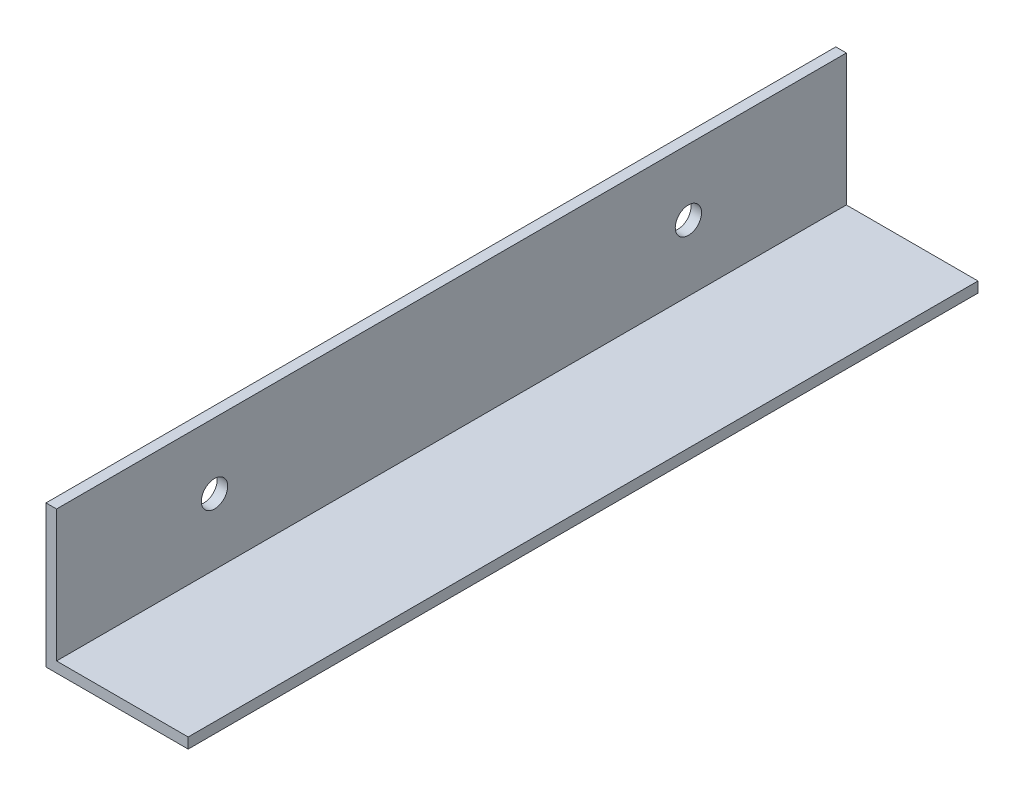
ISO-10303-21;
HEADER;
FILE_DESCRIPTION(('STEP AP214'),'2;1');
FILE_NAME('part.step','',(''),(''),'','','');
FILE_SCHEMA(('AUTOMOTIVE_DESIGN { 1 0 10303 214 1 1 1 1 }'));
ENDSEC;
DATA;
#1=APPLICATION_CONTEXT('core data for automotive mechanical design processes');
#2=APPLICATION_PROTOCOL_DEFINITION('international standard','automotive_design',2000,#1);
#3=PRODUCT_CONTEXT('',#1,'mechanical');
#4=PRODUCT('Part','Part','',(#3));
#5=PRODUCT_RELATED_PRODUCT_CATEGORY('part','',(#4));
#6=PRODUCT_DEFINITION_FORMATION('','',#4);
#7=PRODUCT_DEFINITION_CONTEXT('part definition',#1,'design');
#8=PRODUCT_DEFINITION('design','',#6,#7);
#9=PRODUCT_DEFINITION_SHAPE('','',#8);
#10=(LENGTH_UNIT() NAMED_UNIT(*) SI_UNIT(.MILLI.,.METRE.));
#11=(NAMED_UNIT(*) PLANE_ANGLE_UNIT() SI_UNIT($,.RADIAN.));
#12=(NAMED_UNIT(*) SI_UNIT($,.STERADIAN.) SOLID_ANGLE_UNIT());
#13=UNCERTAINTY_MEASURE_WITH_UNIT(LENGTH_MEASURE(1.E-05),#10,'distance_accuracy_value','');
#14=(GEOMETRIC_REPRESENTATION_CONTEXT(3) GLOBAL_UNCERTAINTY_ASSIGNED_CONTEXT((#13)) GLOBAL_UNIT_ASSIGNED_CONTEXT((#10,
#11,#12)) REPRESENTATION_CONTEXT('',''));
#15=CARTESIAN_POINT('',(0.,0.,0.));
#16=DIRECTION('',(0.,0.,1.));
#17=DIRECTION('',(1.,0.,0.));
#18=AXIS2_PLACEMENT_3D('',#15,#16,#17);
#19=CARTESIAN_POINT('',(0.,0.,150.));
#20=DIRECTION('',(-1.,0.,0.));
#21=DIRECTION('',(0.,0.,1.));
#22=AXIS2_PLACEMENT_3D('',#19,#20,#21);
#23=PLANE('',#22);
#24=CARTESIAN_POINT('',(0.,12.5,30.));
#25=DIRECTION('',(-1.,0.,0.));
#26=DIRECTION('',(0.,0.,1.));
#27=AXIS2_PLACEMENT_3D('',#24,#25,#26);
#28=CIRCLE('',#27,2.5);
#29=CARTESIAN_POINT('',(0.,12.5,32.5));
#30=VERTEX_POINT('',#29);
#31=EDGE_CURVE('E159',#30,#30,#28,.T.);
#32=ORIENTED_EDGE('',*,*,#31,.T.);
#33=EDGE_LOOP('',(#32));
#34=FACE_BOUND('',#33,.T.);
#35=CARTESIAN_POINT('',(0.,12.5,120.));
#36=DIRECTION('',(-1.,0.,0.));
#37=DIRECTION('',(0.,0.,1.));
#38=AXIS2_PLACEMENT_3D('',#35,#36,#37);
#39=CIRCLE('',#38,2.5);
#40=CARTESIAN_POINT('',(0.,12.5,122.5));
#41=VERTEX_POINT('',#40);
#42=EDGE_CURVE('E120',#41,#41,#39,.T.);
#43=ORIENTED_EDGE('',*,*,#42,.T.);
#44=EDGE_LOOP('',(#43));
#45=FACE_BOUND('',#44,.T.);
#46=DIRECTION('',(0.,1.,0.));
#47=VECTOR('',#46,1.);
#48=CARTESIAN_POINT('',(0.,0.,0.));
#49=LINE('',#48,#47);
#50=CARTESIAN_POINT('',(0.,0.,0.));
#51=VERTEX_POINT('',#50);
#52=CARTESIAN_POINT('',(0.,25.,0.));
#53=VERTEX_POINT('',#52);
#54=EDGE_CURVE('E116',#51,#53,#49,.T.);
#55=ORIENTED_EDGE('',*,*,#54,.T.);
#56=DIRECTION('',(0.,0.,-1.));
#57=VECTOR('',#56,1.);
#58=CARTESIAN_POINT('',(0.,25.,150.));
#59=LINE('',#58,#57);
#60=CARTESIAN_POINT('',(0.,25.,150.));
#61=VERTEX_POINT('',#60);
#62=EDGE_CURVE('E11',#61,#53,#59,.T.);
#63=ORIENTED_EDGE('',*,*,#62,.F.);
#64=DIRECTION('',(0.,1.,0.));
#65=VECTOR('',#64,1.);
#66=CARTESIAN_POINT('',(0.,0.,150.));
#67=LINE('',#66,#65);
#68=CARTESIAN_POINT('',(0.,0.,150.));
#69=VERTEX_POINT('',#68);
#70=EDGE_CURVE('E127',#69,#61,#67,.T.);
#71=ORIENTED_EDGE('',*,*,#70,.F.);
#72=DIRECTION('',(0.,0.,-1.));
#73=VECTOR('',#72,1.);
#74=CARTESIAN_POINT('',(0.,0.,150.));
#75=LINE('',#74,#73);
#76=EDGE_CURVE('E112',#69,#51,#75,.T.);
#77=ORIENTED_EDGE('',*,*,#76,.T.);
#78=EDGE_LOOP('',(#55,#63,#71,#77));
#79=FACE_BOUND('',#78,.T.);
#80=ADVANCED_FACE('F32',(#34,#45,#79),#23,.F.);
#81=CARTESIAN_POINT('',(-2.,25.,150.));
#82=DIRECTION('',(0.,-1.,0.));
#83=DIRECTION('',(0.,0.,-1.));
#84=AXIS2_PLACEMENT_3D('',#81,#82,#83);
#85=PLANE('',#84);
#86=DIRECTION('',(-1.,0.,0.));
#87=VECTOR('',#86,1.);
#88=CARTESIAN_POINT('',(-2.,25.,0.));
#89=LINE('',#88,#87);
#90=CARTESIAN_POINT('',(-2.,25.,0.));
#91=VERTEX_POINT('',#90);
#92=EDGE_CURVE('E119',#53,#91,#89,.T.);
#93=ORIENTED_EDGE('',*,*,#92,.T.);
#94=DIRECTION('',(0.,0.,-1.));
#95=VECTOR('',#94,1.);
#96=CARTESIAN_POINT('',(-2.,25.,150.));
#97=LINE('',#96,#95);
#98=CARTESIAN_POINT('',(-2.,25.,150.));
#99=VERTEX_POINT('',#98);
#100=EDGE_CURVE('E40',#99,#91,#97,.T.);
#101=ORIENTED_EDGE('',*,*,#100,.F.);
#102=DIRECTION('',(-1.,0.,0.));
#103=VECTOR('',#102,1.);
#104=CARTESIAN_POINT('',(-2.,25.,150.));
#105=LINE('',#104,#103);
#106=EDGE_CURVE('E85',#61,#99,#105,.T.);
#107=ORIENTED_EDGE('',*,*,#106,.F.);
#108=ORIENTED_EDGE('',*,*,#62,.T.);
#109=EDGE_LOOP('',(#93,#101,#107,#108));
#110=FACE_BOUND('',#109,.T.);
#111=ADVANCED_FACE('F151',(#110),#85,.F.);
#112=CARTESIAN_POINT('',(-2.,-2.,150.));
#113=DIRECTION('',(1.,0.,0.));
#114=DIRECTION('',(0.,0.,-1.));
#115=AXIS2_PLACEMENT_3D('',#112,#113,#114);
#116=PLANE('',#115);
#117=CARTESIAN_POINT('',(-2.,12.5,30.));
#118=DIRECTION('',(1.,0.,0.));
#119=DIRECTION('',(0.,0.,-1.));
#120=AXIS2_PLACEMENT_3D('',#117,#118,#119);
#121=CIRCLE('',#120,2.5);
#122=CARTESIAN_POINT('',(-2.,12.5,27.5));
#123=VERTEX_POINT('',#122);
#124=EDGE_CURVE('E171',#123,#123,#121,.T.);
#125=ORIENTED_EDGE('',*,*,#124,.T.);
#126=EDGE_LOOP('',(#125));
#127=FACE_BOUND('',#126,.T.);
#128=CARTESIAN_POINT('',(-2.,12.5,120.));
#129=DIRECTION('',(1.,0.,0.));
#130=DIRECTION('',(0.,0.,-1.));
#131=AXIS2_PLACEMENT_3D('',#128,#129,#130);
#132=CIRCLE('',#131,2.5);
#133=CARTESIAN_POINT('',(-2.,12.5,117.5));
#134=VERTEX_POINT('',#133);
#135=EDGE_CURVE('E163',#134,#134,#132,.T.);
#136=ORIENTED_EDGE('',*,*,#135,.T.);
#137=EDGE_LOOP('',(#136));
#138=FACE_BOUND('',#137,.T.);
#139=DIRECTION('',(0.,-1.,0.));
#140=VECTOR('',#139,1.);
#141=CARTESIAN_POINT('',(-2.,-2.,0.));
#142=LINE('',#141,#140);
#143=CARTESIAN_POINT('',(-2.,-2.,0.));
#144=VERTEX_POINT('',#143);
#145=EDGE_CURVE('E122',#91,#144,#142,.T.);
#146=ORIENTED_EDGE('',*,*,#145,.T.);
#147=DIRECTION('',(0.,0.,-1.));
#148=VECTOR('',#147,1.);
#149=CARTESIAN_POINT('',(-2.,-2.,150.));
#150=LINE('',#149,#148);
#151=CARTESIAN_POINT('',(-2.,-2.,150.));
#152=VERTEX_POINT('',#151);
#153=EDGE_CURVE('E107',#152,#144,#150,.T.);
#154=ORIENTED_EDGE('',*,*,#153,.F.);
#155=DIRECTION('',(0.,-1.,0.));
#156=VECTOR('',#155,1.);
#157=CARTESIAN_POINT('',(-2.,-2.,150.));
#158=LINE('',#157,#156);
#159=EDGE_CURVE('E98',#99,#152,#158,.T.);
#160=ORIENTED_EDGE('',*,*,#159,.F.);
#161=ORIENTED_EDGE('',*,*,#100,.T.);
#162=EDGE_LOOP('',(#146,#154,#160,#161));
#163=FACE_BOUND('',#162,.T.);
#164=ADVANCED_FACE('F133',(#127,#138,#163),#116,.F.);
#165=CARTESIAN_POINT('',(-2.,-2.,150.));
#166=DIRECTION('',(0.,1.,0.));
#167=DIRECTION('',(0.,0.,1.));
#168=AXIS2_PLACEMENT_3D('',#165,#166,#167);
#169=PLANE('',#168);
#170=DIRECTION('',(1.,0.,0.));
#171=VECTOR('',#170,1.);
#172=CARTESIAN_POINT('',(-2.,-2.,0.));
#173=LINE('',#172,#171);
#174=CARTESIAN_POINT('',(25.,-2.,0.));
#175=VERTEX_POINT('',#174);
#176=EDGE_CURVE('E106',#144,#175,#173,.T.);
#177=ORIENTED_EDGE('',*,*,#176,.T.);
#178=DIRECTION('',(0.,0.,-1.));
#179=VECTOR('',#178,1.);
#180=CARTESIAN_POINT('',(25.,-2.,150.));
#181=LINE('',#180,#179);
#182=CARTESIAN_POINT('',(25.,-2.,150.));
#183=VERTEX_POINT('',#182);
#184=EDGE_CURVE('E103',#183,#175,#181,.T.);
#185=ORIENTED_EDGE('',*,*,#184,.F.);
#186=DIRECTION('',(1.,0.,0.));
#187=VECTOR('',#186,1.);
#188=CARTESIAN_POINT('',(-2.,-2.,150.));
#189=LINE('',#188,#187);
#190=EDGE_CURVE('E92',#152,#183,#189,.T.);
#191=ORIENTED_EDGE('',*,*,#190,.F.);
#192=ORIENTED_EDGE('',*,*,#153,.T.);
#193=EDGE_LOOP('',(#177,#185,#191,#192));
#194=FACE_BOUND('',#193,.T.);
#195=ADVANCED_FACE('F104',(#194),#169,.F.);
#196=CARTESIAN_POINT('',(25.,0.,150.));
#197=DIRECTION('',(-1.,0.,0.));
#198=DIRECTION('',(0.,0.,1.));
#199=AXIS2_PLACEMENT_3D('',#196,#197,#198);
#200=PLANE('',#199);
#201=DIRECTION('',(0.,1.,0.));
#202=VECTOR('',#201,1.);
#203=CARTESIAN_POINT('',(25.,0.,0.));
#204=LINE('',#203,#202);
#205=CARTESIAN_POINT('',(25.,0.,0.));
#206=VERTEX_POINT('',#205);
#207=EDGE_CURVE('E71',#175,#206,#204,.T.);
#208=ORIENTED_EDGE('',*,*,#207,.T.);
#209=DIRECTION('',(0.,0.,-1.));
#210=VECTOR('',#209,1.);
#211=CARTESIAN_POINT('',(25.,0.,150.));
#212=LINE('',#211,#210);
#213=CARTESIAN_POINT('',(25.,0.,150.));
#214=VERTEX_POINT('',#213);
#215=EDGE_CURVE('E108',#214,#206,#212,.T.);
#216=ORIENTED_EDGE('',*,*,#215,.F.);
#217=DIRECTION('',(0.,1.,0.));
#218=VECTOR('',#217,1.);
#219=CARTESIAN_POINT('',(25.,0.,150.));
#220=LINE('',#219,#218);
#221=EDGE_CURVE('E96',#183,#214,#220,.T.);
#222=ORIENTED_EDGE('',*,*,#221,.F.);
#223=ORIENTED_EDGE('',*,*,#184,.T.);
#224=EDGE_LOOP('',(#208,#216,#222,#223));
#225=FACE_BOUND('',#224,.T.);
#226=ADVANCED_FACE('F110',(#225),#200,.F.);
#227=CARTESIAN_POINT('',(0.,0.,150.));
#228=DIRECTION('',(0.,-1.,0.));
#229=DIRECTION('',(0.,0.,-1.));
#230=AXIS2_PLACEMENT_3D('',#227,#228,#229);
#231=PLANE('',#230);
#232=DIRECTION('',(-1.,0.,0.));
#233=VECTOR('',#232,1.);
#234=CARTESIAN_POINT('',(0.,0.,0.));
#235=LINE('',#234,#233);
#236=EDGE_CURVE('E77',#206,#51,#235,.T.);
#237=ORIENTED_EDGE('',*,*,#236,.T.);
#238=ORIENTED_EDGE('',*,*,#76,.F.);
#239=DIRECTION('',(-1.,0.,0.));
#240=VECTOR('',#239,1.);
#241=CARTESIAN_POINT('',(0.,0.,150.));
#242=LINE('',#241,#240);
#243=EDGE_CURVE('E48',#214,#69,#242,.T.);
#244=ORIENTED_EDGE('',*,*,#243,.F.);
#245=ORIENTED_EDGE('',*,*,#215,.T.);
#246=EDGE_LOOP('',(#237,#238,#244,#245));
#247=FACE_BOUND('',#246,.T.);
#248=ADVANCED_FACE('F140',(#247),#231,.F.);
#249=CARTESIAN_POINT('',(0.,0.,150.));
#250=DIRECTION('',(0.,0.,-1.));
#251=DIRECTION('',(-1.,0.,0.));
#252=AXIS2_PLACEMENT_3D('',#249,#250,#251);
#253=PLANE('',#252);
#254=ORIENTED_EDGE('',*,*,#70,.T.);
#255=ORIENTED_EDGE('',*,*,#106,.T.);
#256=ORIENTED_EDGE('',*,*,#159,.T.);
#257=ORIENTED_EDGE('',*,*,#190,.T.);
#258=ORIENTED_EDGE('',*,*,#221,.T.);
#259=ORIENTED_EDGE('',*,*,#243,.T.);
#260=EDGE_LOOP('',(#254,#255,#256,#257,#258,#259));
#261=FACE_BOUND('',#260,.T.);
#262=ADVANCED_FACE('F94',(#261),#253,.F.);
#263=CARTESIAN_POINT('',(0.,0.,0.));
#264=DIRECTION('',(0.,0.,-1.));
#265=DIRECTION('',(-1.,0.,0.));
#266=AXIS2_PLACEMENT_3D('',#263,#264,#265);
#267=PLANE('',#266);
#268=ORIENTED_EDGE('',*,*,#54,.F.);
#269=ORIENTED_EDGE('',*,*,#236,.F.);
#270=ORIENTED_EDGE('',*,*,#207,.F.);
#271=ORIENTED_EDGE('',*,*,#176,.F.);
#272=ORIENTED_EDGE('',*,*,#145,.F.);
#273=ORIENTED_EDGE('',*,*,#92,.F.);
#274=EDGE_LOOP('',(#268,#269,#270,#271,#272,#273));
#275=FACE_BOUND('',#274,.T.);
#276=ADVANCED_FACE('F136',(#275),#267,.T.);
#277=CARTESIAN_POINT('',(-2.,12.5,120.));
#278=DIRECTION('',(1.,0.,0.));
#279=DIRECTION('',(0.,0.,-1.));
#280=AXIS2_PLACEMENT_3D('',#277,#278,#279);
#281=CYLINDRICAL_SURFACE('',#280,2.5);
#282=ORIENTED_EDGE('',*,*,#135,.F.);
#283=EDGE_LOOP('',(#282));
#284=FACE_BOUND('',#283,.T.);
#285=ORIENTED_EDGE('',*,*,#42,.F.);
#286=EDGE_LOOP('',(#285));
#287=FACE_BOUND('',#286,.T.);
#288=ADVANCED_FACE('F180',(#284,#287),#281,.F.);
#289=CARTESIAN_POINT('',(-2.,12.5,30.));
#290=DIRECTION('',(1.,0.,0.));
#291=DIRECTION('',(0.,0.,-1.));
#292=AXIS2_PLACEMENT_3D('',#289,#290,#291);
#293=CYLINDRICAL_SURFACE('',#292,2.5);
#294=ORIENTED_EDGE('',*,*,#124,.F.);
#295=EDGE_LOOP('',(#294));
#296=FACE_BOUND('',#295,.T.);
#297=ORIENTED_EDGE('',*,*,#31,.F.);
#298=EDGE_LOOP('',(#297));
#299=FACE_BOUND('',#298,.T.);
#300=ADVANCED_FACE('F177',(#296,#299),#293,.F.);
#301=CLOSED_SHELL('',(#80,#111,#164,#195,#226,#248,#262,#276,#288,#300));
#302=MANIFOLD_SOLID_BREP('B2',#301);
#303=ADVANCED_BREP_SHAPE_REPRESENTATION('',(#18,#302),#14);
#304=SHAPE_DEFINITION_REPRESENTATION(#9,#303);
ENDSEC;
END-ISO-10303-21;
